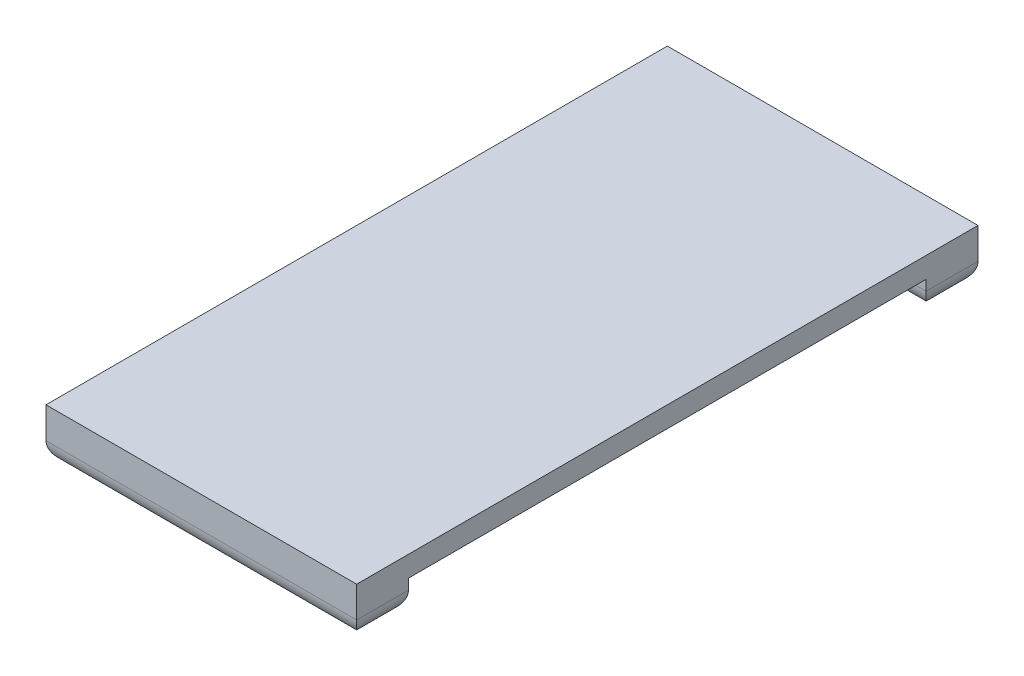
ISO-10303-21;
HEADER;
FILE_DESCRIPTION(('STEP AP214'),'2;1');
FILE_NAME('part.step','',(''),(''),'','','');
FILE_SCHEMA(('AUTOMOTIVE_DESIGN { 1 0 10303 214 1 1 1 1 }'));
ENDSEC;
DATA;
#1=APPLICATION_CONTEXT('core data for automotive mechanical design processes');
#2=APPLICATION_PROTOCOL_DEFINITION('international standard','automotive_design',2000,#1);
#3=PRODUCT_CONTEXT('',#1,'mechanical');
#4=PRODUCT('Part','Part','',(#3));
#5=PRODUCT_RELATED_PRODUCT_CATEGORY('part','',(#4));
#6=PRODUCT_DEFINITION_FORMATION('','',#4);
#7=PRODUCT_DEFINITION_CONTEXT('part definition',#1,'design');
#8=PRODUCT_DEFINITION('design','',#6,#7);
#9=PRODUCT_DEFINITION_SHAPE('','',#8);
#10=(LENGTH_UNIT() NAMED_UNIT(*) SI_UNIT(.MILLI.,.METRE.));
#11=(NAMED_UNIT(*) PLANE_ANGLE_UNIT() SI_UNIT($,.RADIAN.));
#12=(NAMED_UNIT(*) SI_UNIT($,.STERADIAN.) SOLID_ANGLE_UNIT());
#13=UNCERTAINTY_MEASURE_WITH_UNIT(LENGTH_MEASURE(1.E-05),#10,'distance_accuracy_value','');
#14=(GEOMETRIC_REPRESENTATION_CONTEXT(3) GLOBAL_UNCERTAINTY_ASSIGNED_CONTEXT((#13)) GLOBAL_UNIT_ASSIGNED_CONTEXT((#10,
#11,#12)) REPRESENTATION_CONTEXT('',''));
#15=CARTESIAN_POINT('',(0.,0.,0.));
#16=DIRECTION('',(0.,0.,1.));
#17=DIRECTION('',(1.,0.,0.));
#18=AXIS2_PLACEMENT_3D('',#15,#16,#17);
#19=CARTESIAN_POINT('',(-120.323741007194,30.,-16.8165467625899));
#20=DIRECTION('',(0.,0.,1.));
#21=DIRECTION('',(1.,0.,0.));
#22=AXIS2_PLACEMENT_3D('',#19,#20,#21);
#23=PLANE('',#22);
#24=DIRECTION('',(0.,-1.,0.));
#25=VECTOR('',#24,1.);
#26=CARTESIAN_POINT('',(4.67625899280566,36.,-16.8165467625899));
#27=LINE('',#26,#25);
#28=CARTESIAN_POINT('',(4.67625899280566,30.,-16.8165467625899));
#29=VERTEX_POINT('',#28);
#30=CARTESIAN_POINT('',(4.67625899280566,20.,-16.8165467625899));
#31=VERTEX_POINT('',#30);
#32=EDGE_CURVE('E180',#29,#31,#27,.T.);
#33=ORIENTED_EDGE('',*,*,#32,.T.);
#34=DIRECTION('',(-1.,0.,0.));
#35=VECTOR('',#34,1.);
#36=CARTESIAN_POINT('',(-120.323741007194,20.,-16.8165467625899));
#37=LINE('',#36,#35);
#38=CARTESIAN_POINT('',(-120.323741007194,20.,-16.8165467625899));
#39=VERTEX_POINT('',#38);
#40=EDGE_CURVE('E230',#31,#39,#37,.T.);
#41=ORIENTED_EDGE('',*,*,#40,.T.);
#42=DIRECTION('',(0.,-1.,0.));
#43=VECTOR('',#42,1.);
#44=CARTESIAN_POINT('',(-120.323741007194,30.,-16.8165467625899));
#45=LINE('',#44,#43);
#46=CARTESIAN_POINT('',(-120.323741007194,30.,-16.8165467625899));
#47=VERTEX_POINT('',#46);
#48=EDGE_CURVE('E293',#47,#39,#45,.T.);
#49=ORIENTED_EDGE('',*,*,#48,.F.);
#50=DIRECTION('',(-1.,0.,0.));
#51=VECTOR('',#50,1.);
#52=CARTESIAN_POINT('',(-120.323741007194,30.,-16.8165467625899));
#53=LINE('',#52,#51);
#54=EDGE_CURVE('E175',#29,#47,#53,.T.);
#55=ORIENTED_EDGE('',*,*,#54,.F.);
#56=EDGE_LOOP('',(#33,#41,#49,#55));
#57=FACE_BOUND('',#56,.T.);
#58=ADVANCED_FACE('F39',(#57),#23,.F.);
#59=CARTESIAN_POINT('',(-120.323741007194,30.,-516.81654676259));
#60=DIRECTION('',(0.,0.,-1.));
#61=DIRECTION('',(-1.,0.,0.));
#62=AXIS2_PLACEMENT_3D('',#59,#60,#61);
#63=PLANE('',#62);
#64=DIRECTION('',(0.,-1.,0.));
#65=VECTOR('',#64,1.);
#66=CARTESIAN_POINT('',(-120.323741007194,30.,-516.81654676259));
#67=LINE('',#66,#65);
#68=CARTESIAN_POINT('',(-120.323741007194,30.,-516.81654676259));
#69=VERTEX_POINT('',#68);
#70=CARTESIAN_POINT('',(-120.323741007194,20.,-516.81654676259));
#71=VERTEX_POINT('',#70);
#72=EDGE_CURVE('E174',#69,#71,#67,.T.);
#73=ORIENTED_EDGE('',*,*,#72,.T.);
#74=DIRECTION('',(1.,0.,0.));
#75=VECTOR('',#74,1.);
#76=CARTESIAN_POINT('',(-120.323741007194,20.,-516.81654676259));
#77=LINE('',#76,#75);
#78=CARTESIAN_POINT('',(4.67625899280566,20.,-516.81654676259));
#79=VERTEX_POINT('',#78);
#80=EDGE_CURVE('E226',#71,#79,#77,.T.);
#81=ORIENTED_EDGE('',*,*,#80,.T.);
#82=DIRECTION('',(0.,-1.,0.));
#83=VECTOR('',#82,1.);
#84=CARTESIAN_POINT('',(4.67625899280566,36.,-516.81654676259));
#85=LINE('',#84,#83);
#86=CARTESIAN_POINT('',(4.67625899280565,30.,-516.81654676259));
#87=VERTEX_POINT('',#86);
#88=EDGE_CURVE('E274',#87,#79,#85,.T.);
#89=ORIENTED_EDGE('',*,*,#88,.F.);
#90=DIRECTION('',(1.,0.,0.));
#91=VECTOR('',#90,1.);
#92=CARTESIAN_POINT('',(-120.323741007194,30.,-516.81654676259));
#93=LINE('',#92,#91);
#94=EDGE_CURVE('E289',#69,#87,#93,.T.);
#95=ORIENTED_EDGE('',*,*,#94,.F.);
#96=EDGE_LOOP('',(#73,#81,#89,#95));
#97=FACE_BOUND('',#96,.T.);
#98=ADVANCED_FACE('F370',(#97),#63,.F.);
#99=CARTESIAN_POINT('',(0.,30.,0.));
#100=DIRECTION('',(0.,-1.,0.));
#101=DIRECTION('',(0.,0.,-1.));
#102=AXIS2_PLACEMENT_3D('',#99,#100,#101);
#103=PLANE('',#102);
#104=DIRECTION('',(0.,0.,-1.));
#105=VECTOR('',#104,1.);
#106=CARTESIAN_POINT('',(4.67625899280566,30.,0.));
#107=LINE('',#106,#105);
#108=EDGE_CURVE('E184',#29,#87,#107,.T.);
#109=ORIENTED_EDGE('',*,*,#108,.F.);
#110=ORIENTED_EDGE('',*,*,#54,.T.);
#111=DIRECTION('',(0.,0.,-1.));
#112=VECTOR('',#111,1.);
#113=CARTESIAN_POINT('',(-120.323741007194,30.,-16.8165467625899));
#114=LINE('',#113,#112);
#115=EDGE_CURVE('E285',#47,#69,#114,.T.);
#116=ORIENTED_EDGE('',*,*,#115,.T.);
#117=ORIENTED_EDGE('',*,*,#94,.T.);
#118=EDGE_LOOP('',(#109,#110,#116,#117));
#119=FACE_BOUND('',#118,.T.);
#120=ADVANCED_FACE('F414',(#119),#103,.T.);
#121=CARTESIAN_POINT('',(-120.323741007194,50.,-566.81654676259));
#122=DIRECTION('',(1.,0.,0.));
#123=DIRECTION('',(0.,0.,-1.));
#124=AXIS2_PLACEMENT_3D('',#121,#122,#123);
#125=PLANE('',#124);
#126=DIRECTION('',(0.,-1.,0.));
#127=VECTOR('',#126,1.);
#128=CARTESIAN_POINT('',(-120.323741007194,50.,-566.81654676259));
#129=LINE('',#128,#127);
#130=CARTESIAN_POINT('',(-120.323741007194,50.,-566.81654676259));
#131=VERTEX_POINT('',#130);
#132=CARTESIAN_POINT('',(-120.323741007194,20.,-566.81654676259));
#133=VERTEX_POINT('',#132);
#134=EDGE_CURVE('E312',#131,#133,#129,.T.);
#135=ORIENTED_EDGE('',*,*,#134,.T.);
#136=DIRECTION('',(0.,0.,1.));
#137=VECTOR('',#136,1.);
#138=CARTESIAN_POINT('',(-120.323741007194,20.,-566.81654676259));
#139=LINE('',#138,#137);
#140=EDGE_CURVE('E224',#133,#71,#139,.T.);
#141=ORIENTED_EDGE('',*,*,#140,.T.);
#142=ORIENTED_EDGE('',*,*,#72,.F.);
#143=ORIENTED_EDGE('',*,*,#115,.F.);
#144=ORIENTED_EDGE('',*,*,#48,.T.);
#145=DIRECTION('',(0.,0.,1.));
#146=VECTOR('',#145,1.);
#147=CARTESIAN_POINT('',(-120.323741007194,20.,-566.81654676259));
#148=LINE('',#147,#146);
#149=CARTESIAN_POINT('',(-120.323741007194,20.,33.1834532374101));
#150=VERTEX_POINT('',#149);
#151=EDGE_CURVE('E222',#39,#150,#148,.T.);
#152=ORIENTED_EDGE('',*,*,#151,.T.);
#153=DIRECTION('',(0.,-1.,0.));
#154=VECTOR('',#153,1.);
#155=CARTESIAN_POINT('',(-120.323741007194,50.,33.1834532374101));
#156=LINE('',#155,#154);
#157=CARTESIAN_POINT('',(-120.323741007194,50.,33.1834532374101));
#158=VERTEX_POINT('',#157);
#159=EDGE_CURVE('E185',#158,#150,#156,.T.);
#160=ORIENTED_EDGE('',*,*,#159,.F.);
#161=DIRECTION('',(0.,0.,1.));
#162=VECTOR('',#161,1.);
#163=CARTESIAN_POINT('',(-120.323741007194,50.,-566.81654676259));
#164=LINE('',#163,#162);
#165=EDGE_CURVE('E296',#131,#158,#164,.T.);
#166=ORIENTED_EDGE('',*,*,#165,.F.);
#167=EDGE_LOOP('',(#135,#141,#142,#143,#144,#152,#160,#166));
#168=FACE_BOUND('',#167,.T.);
#169=ADVANCED_FACE('F365',(#168),#125,.F.);
#170=CARTESIAN_POINT('',(-120.323741007194,50.,33.1834532374101));
#171=DIRECTION('',(0.,0.,-1.));
#172=DIRECTION('',(-1.,0.,0.));
#173=AXIS2_PLACEMENT_3D('',#170,#171,#172);
#174=PLANE('',#173);
#175=ORIENTED_EDGE('',*,*,#159,.T.);
#176=DIRECTION('',(1.,0.,0.));
#177=VECTOR('',#176,1.);
#178=CARTESIAN_POINT('',(-120.323741007194,20.,33.1834532374101));
#179=LINE('',#178,#177);
#180=CARTESIAN_POINT('',(179.676258992806,20.,33.1834532374101));
#181=VERTEX_POINT('',#180);
#182=EDGE_CURVE('E232',#150,#181,#179,.T.);
#183=ORIENTED_EDGE('',*,*,#182,.T.);
#184=DIRECTION('',(0.,-1.,0.));
#185=VECTOR('',#184,1.);
#186=CARTESIAN_POINT('',(179.676258992806,50.,33.1834532374101));
#187=LINE('',#186,#185);
#188=CARTESIAN_POINT('',(179.676258992806,50.,33.1834532374101));
#189=VERTEX_POINT('',#188);
#190=EDGE_CURVE('E191',#189,#181,#187,.T.);
#191=ORIENTED_EDGE('',*,*,#190,.F.);
#192=DIRECTION('',(1.,0.,0.));
#193=VECTOR('',#192,1.);
#194=CARTESIAN_POINT('',(-120.323741007194,50.,33.1834532374101));
#195=LINE('',#194,#193);
#196=EDGE_CURVE('E306',#158,#189,#195,.T.);
#197=ORIENTED_EDGE('',*,*,#196,.F.);
#198=EDGE_LOOP('',(#175,#183,#191,#197));
#199=FACE_BOUND('',#198,.T.);
#200=ADVANCED_FACE('F393',(#199),#174,.F.);
#201=CARTESIAN_POINT('',(179.676258992806,50.,-566.81654676259));
#202=DIRECTION('',(-1.,0.,0.));
#203=DIRECTION('',(0.,0.,1.));
#204=AXIS2_PLACEMENT_3D('',#201,#202,#203);
#205=PLANE('',#204);
#206=ORIENTED_EDGE('',*,*,#190,.T.);
#207=DIRECTION('',(0.,0.,-1.));
#208=VECTOR('',#207,1.);
#209=CARTESIAN_POINT('',(179.676258992806,20.,-566.81654676259));
#210=LINE('',#209,#208);
#211=CARTESIAN_POINT('',(179.676258992806,20.,-16.8165467625899));
#212=VERTEX_POINT('',#211);
#213=EDGE_CURVE('E236',#181,#212,#210,.T.);
#214=ORIENTED_EDGE('',*,*,#213,.T.);
#215=DIRECTION('',(0.,-1.,0.));
#216=VECTOR('',#215,1.);
#217=CARTESIAN_POINT('',(179.676258992806,30.,-16.8165467625899));
#218=LINE('',#217,#216);
#219=CARTESIAN_POINT('',(179.676258992806,30.,-16.8165467625899));
#220=VERTEX_POINT('',#219);
#221=EDGE_CURVE('E297',#220,#212,#218,.T.);
#222=ORIENTED_EDGE('',*,*,#221,.F.);
#223=DIRECTION('',(0.,0.,1.));
#224=VECTOR('',#223,1.);
#225=CARTESIAN_POINT('',(179.676258992806,30.,-16.8165467625899));
#226=LINE('',#225,#224);
#227=CARTESIAN_POINT('',(179.676258992806,30.,-516.81654676259));
#228=VERTEX_POINT('',#227);
#229=EDGE_CURVE('E172',#228,#220,#226,.T.);
#230=ORIENTED_EDGE('',*,*,#229,.F.);
#231=DIRECTION('',(0.,-1.,0.));
#232=VECTOR('',#231,1.);
#233=CARTESIAN_POINT('',(179.676258992806,30.,-516.81654676259));
#234=LINE('',#233,#232);
#235=CARTESIAN_POINT('',(179.676258992806,20.,-516.81654676259));
#236=VERTEX_POINT('',#235);
#237=EDGE_CURVE('E299',#228,#236,#234,.T.);
#238=ORIENTED_EDGE('',*,*,#237,.T.);
#239=DIRECTION('',(0.,0.,-1.));
#240=VECTOR('',#239,1.);
#241=CARTESIAN_POINT('',(179.676258992806,20.,-566.81654676259));
#242=LINE('',#241,#240);
#243=CARTESIAN_POINT('',(179.676258992806,20.,-566.81654676259));
#244=VERTEX_POINT('',#243);
#245=EDGE_CURVE('E234',#236,#244,#242,.T.);
#246=ORIENTED_EDGE('',*,*,#245,.T.);
#247=DIRECTION('',(0.,-1.,0.));
#248=VECTOR('',#247,1.);
#249=CARTESIAN_POINT('',(179.676258992806,50.,-566.81654676259));
#250=LINE('',#249,#248);
#251=CARTESIAN_POINT('',(179.676258992806,50.,-566.81654676259));
#252=VERTEX_POINT('',#251);
#253=EDGE_CURVE('E315',#252,#244,#250,.T.);
#254=ORIENTED_EDGE('',*,*,#253,.F.);
#255=DIRECTION('',(0.,0.,-1.));
#256=VECTOR('',#255,1.);
#257=CARTESIAN_POINT('',(179.676258992806,50.,-566.81654676259));
#258=LINE('',#257,#256);
#259=EDGE_CURVE('E308',#189,#252,#258,.T.);
#260=ORIENTED_EDGE('',*,*,#259,.F.);
#261=EDGE_LOOP('',(#206,#214,#222,#230,#238,#246,#254,#260));
#262=FACE_BOUND('',#261,.T.);
#263=ADVANCED_FACE('F321',(#262),#205,.F.);
#264=CARTESIAN_POINT('',(-120.323741007194,50.,-566.81654676259));
#265=DIRECTION('',(0.,0.,1.));
#266=DIRECTION('',(1.,0.,0.));
#267=AXIS2_PLACEMENT_3D('',#264,#265,#266);
#268=PLANE('',#267);
#269=ORIENTED_EDGE('',*,*,#253,.T.);
#270=DIRECTION('',(-1.,0.,0.));
#271=VECTOR('',#270,1.);
#272=CARTESIAN_POINT('',(-120.323741007194,20.,-566.81654676259));
#273=LINE('',#272,#271);
#274=EDGE_CURVE('E188',#244,#133,#273,.T.);
#275=ORIENTED_EDGE('',*,*,#274,.T.);
#276=ORIENTED_EDGE('',*,*,#134,.F.);
#277=DIRECTION('',(-1.,0.,0.));
#278=VECTOR('',#277,1.);
#279=CARTESIAN_POINT('',(-120.323741007194,50.,-566.81654676259));
#280=LINE('',#279,#278);
#281=EDGE_CURVE('E310',#252,#131,#280,.T.);
#282=ORIENTED_EDGE('',*,*,#281,.F.);
#283=EDGE_LOOP('',(#269,#275,#276,#282));
#284=FACE_BOUND('',#283,.T.);
#285=ADVANCED_FACE('F349',(#284),#268,.F.);
#286=CARTESIAN_POINT('',(0.,50.,0.));
#287=DIRECTION('',(0.,1.,0.));
#288=DIRECTION('',(0.,0.,1.));
#289=AXIS2_PLACEMENT_3D('',#286,#287,#288);
#290=PLANE('',#289);
#291=ORIENTED_EDGE('',*,*,#165,.T.);
#292=ORIENTED_EDGE('',*,*,#196,.T.);
#293=ORIENTED_EDGE('',*,*,#259,.T.);
#294=ORIENTED_EDGE('',*,*,#281,.T.);
#295=EDGE_LOOP('',(#291,#292,#293,#294));
#296=FACE_BOUND('',#295,.T.);
#297=ADVANCED_FACE('F395',(#296),#290,.T.);
#298=CARTESIAN_POINT('',(0.,0.,0.));
#299=DIRECTION('',(0.,1.,0.));
#300=DIRECTION('',(0.,0.,1.));
#301=AXIS2_PLACEMENT_3D('',#298,#299,#300);
#302=PLANE('',#301);
#303=DIRECTION('',(0.,0.,1.));
#304=VECTOR('',#303,1.);
#305=CARTESIAN_POINT('',(-100.323741007194,0.,0.));
#306=LINE('',#305,#304);
#307=CARTESIAN_POINT('',(-100.323741007194,0.,-536.81654676259));
#308=VERTEX_POINT('',#307);
#309=CARTESIAN_POINT('',(-100.323741007194,0.,-546.81654676259));
#310=VERTEX_POINT('',#309);
#311=EDGE_CURVE('E217',#308,#310,#306,.F.);
#312=ORIENTED_EDGE('',*,*,#311,.T.);
#313=DIRECTION('',(-1.,0.,0.));
#314=VECTOR('',#313,1.);
#315=CARTESIAN_POINT('',(0.,0.,-546.81654676259));
#316=LINE('',#315,#314);
#317=CARTESIAN_POINT('',(159.676258992806,0.,-546.81654676259));
#318=VERTEX_POINT('',#317);
#319=EDGE_CURVE('E219',#310,#318,#316,.F.);
#320=ORIENTED_EDGE('',*,*,#319,.T.);
#321=DIRECTION('',(0.,0.,-1.));
#322=VECTOR('',#321,1.);
#323=CARTESIAN_POINT('',(159.676258992806,0.,0.));
#324=LINE('',#323,#322);
#325=CARTESIAN_POINT('',(159.676258992806,0.,-536.81654676259));
#326=VERTEX_POINT('',#325);
#327=EDGE_CURVE('E197',#318,#326,#324,.F.);
#328=ORIENTED_EDGE('',*,*,#327,.T.);
#329=DIRECTION('',(1.,0.,0.));
#330=VECTOR('',#329,1.);
#331=CARTESIAN_POINT('',(-1.98662030071865E-13,0.,-536.81654676259));
#332=LINE('',#331,#330);
#333=CARTESIAN_POINT('',(34.6762589928057,0.,-536.81654676259));
#334=VERTEX_POINT('',#333);
#335=EDGE_CURVE('E199',#326,#334,#332,.F.);
#336=ORIENTED_EDGE('',*,*,#335,.T.);
#337=DIRECTION('',(0.,0.,1.));
#338=VECTOR('',#337,1.);
#339=CARTESIAN_POINT('',(34.6762589928057,0.,-16.8165467625899));
#340=LINE('',#339,#338);
#341=CARTESIAN_POINT('',(34.6762589928057,0.,3.1834532374101));
#342=VERTEX_POINT('',#341);
#343=EDGE_CURVE('E201',#334,#342,#340,.T.);
#344=ORIENTED_EDGE('',*,*,#343,.T.);
#345=DIRECTION('',(-1.,0.,0.));
#346=VECTOR('',#345,1.);
#347=CARTESIAN_POINT('',(0.,0.,3.1834532374101));
#348=LINE('',#347,#346);
#349=CARTESIAN_POINT('',(159.676258992806,0.,3.18345323741012));
#350=VERTEX_POINT('',#349);
#351=EDGE_CURVE('E203',#342,#350,#348,.F.);
#352=ORIENTED_EDGE('',*,*,#351,.T.);
#353=DIRECTION('',(0.,0.,-1.));
#354=VECTOR('',#353,1.);
#355=CARTESIAN_POINT('',(159.676258992806,0.,0.));
#356=LINE('',#355,#354);
#357=CARTESIAN_POINT('',(159.676258992806,0.,13.1834532374101));
#358=VERTEX_POINT('',#357);
#359=EDGE_CURVE('E205',#350,#358,#356,.F.);
#360=ORIENTED_EDGE('',*,*,#359,.T.);
#361=DIRECTION('',(1.,0.,0.));
#362=VECTOR('',#361,1.);
#363=CARTESIAN_POINT('',(0.,0.,13.1834532374101));
#364=LINE('',#363,#362);
#365=CARTESIAN_POINT('',(-100.323741007194,0.,13.1834532374101));
#366=VERTEX_POINT('',#365);
#367=EDGE_CURVE('E207',#358,#366,#364,.F.);
#368=ORIENTED_EDGE('',*,*,#367,.T.);
#369=DIRECTION('',(0.,0.,1.));
#370=VECTOR('',#369,1.);
#371=CARTESIAN_POINT('',(-100.323741007194,0.,0.));
#372=LINE('',#371,#370);
#373=CARTESIAN_POINT('',(-100.323741007194,0.,3.18345323741008));
#374=VERTEX_POINT('',#373);
#375=EDGE_CURVE('E209',#366,#374,#372,.F.);
#376=ORIENTED_EDGE('',*,*,#375,.T.);
#377=DIRECTION('',(-1.,0.,0.));
#378=VECTOR('',#377,1.);
#379=CARTESIAN_POINT('',(0.,0.,3.1834532374101));
#380=LINE('',#379,#378);
#381=CARTESIAN_POINT('',(24.6762589928057,0.,3.1834532374101));
#382=VERTEX_POINT('',#381);
#383=EDGE_CURVE('E211',#374,#382,#380,.F.);
#384=ORIENTED_EDGE('',*,*,#383,.T.);
#385=DIRECTION('',(0.,0.,-1.));
#386=VECTOR('',#385,1.);
#387=CARTESIAN_POINT('',(24.6762589928057,0.,-516.81654676259));
#388=LINE('',#387,#386);
#389=CARTESIAN_POINT('',(24.6762589928057,0.,-536.81654676259));
#390=VERTEX_POINT('',#389);
#391=EDGE_CURVE('E213',#382,#390,#388,.T.);
#392=ORIENTED_EDGE('',*,*,#391,.T.);
#393=DIRECTION('',(1.,0.,0.));
#394=VECTOR('',#393,1.);
#395=CARTESIAN_POINT('',(-1.98662030071865E-13,0.,-536.81654676259));
#396=LINE('',#395,#394);
#397=EDGE_CURVE('E215',#390,#308,#396,.F.);
#398=ORIENTED_EDGE('',*,*,#397,.T.);
#399=EDGE_LOOP('',(#312,#320,#328,#336,#344,#352,#360,#368,#376,#384,#392,#398));
#400=FACE_BOUND('',#399,.T.);
#401=ADVANCED_FACE('F397',(#400),#302,.F.);
#402=ORIENTED_EDGE('',*,*,#221,.T.);
#403=DIRECTION('',(-1.,0.,0.));
#404=VECTOR('',#403,1.);
#405=CARTESIAN_POINT('',(-120.323741007194,20.,-16.8165467625899));
#406=LINE('',#405,#404);
#407=CARTESIAN_POINT('',(54.6762589928057,20.,-16.8165467625899));
#408=VERTEX_POINT('',#407);
#409=EDGE_CURVE('E63',#212,#408,#406,.T.);
#410=ORIENTED_EDGE('',*,*,#409,.T.);
#411=DIRECTION('',(0.,-1.,0.));
#412=VECTOR('',#411,1.);
#413=CARTESIAN_POINT('',(54.6762589928057,36.,-16.8165467625899));
#414=LINE('',#413,#412);
#415=CARTESIAN_POINT('',(54.6762589928057,30.,-16.8165467625899));
#416=VERTEX_POINT('',#415);
#417=EDGE_CURVE('E177',#416,#408,#414,.T.);
#418=ORIENTED_EDGE('',*,*,#417,.F.);
#419=EDGE_CURVE('E166',#220,#416,#53,.T.);
#420=ORIENTED_EDGE('',*,*,#419,.F.);
#421=EDGE_LOOP('',(#402,#410,#418,#420));
#422=FACE_BOUND('',#421,.T.);
#423=ADVANCED_FACE('F178',(#422),#23,.F.);
#424=DIRECTION('',(0.,-1.,0.));
#425=VECTOR('',#424,1.);
#426=CARTESIAN_POINT('',(54.6762589928057,36.,-516.81654676259));
#427=LINE('',#426,#425);
#428=CARTESIAN_POINT('',(54.6762589928057,30.,-516.81654676259));
#429=VERTEX_POINT('',#428);
#430=CARTESIAN_POINT('',(54.6762589928057,20.,-516.81654676259));
#431=VERTEX_POINT('',#430);
#432=EDGE_CURVE('E181',#429,#431,#427,.T.);
#433=ORIENTED_EDGE('',*,*,#432,.T.);
#434=DIRECTION('',(1.,0.,0.));
#435=VECTOR('',#434,1.);
#436=CARTESIAN_POINT('',(-120.323741007194,20.,-516.81654676259));
#437=LINE('',#436,#435);
#438=EDGE_CURVE('E11',#431,#236,#437,.T.);
#439=ORIENTED_EDGE('',*,*,#438,.T.);
#440=ORIENTED_EDGE('',*,*,#237,.F.);
#441=EDGE_CURVE('E288',#429,#228,#93,.T.);
#442=ORIENTED_EDGE('',*,*,#441,.F.);
#443=EDGE_LOOP('',(#433,#439,#440,#442));
#444=FACE_BOUND('',#443,.T.);
#445=ADVANCED_FACE('F344',(#444),#63,.F.);
#446=DIRECTION('',(0.,0.,1.));
#447=VECTOR('',#446,1.);
#448=CARTESIAN_POINT('',(54.6762589928057,30.,0.));
#449=LINE('',#448,#447);
#450=EDGE_CURVE('E169',#429,#416,#449,.T.);
#451=ORIENTED_EDGE('',*,*,#450,.F.);
#452=ORIENTED_EDGE('',*,*,#441,.T.);
#453=ORIENTED_EDGE('',*,*,#229,.T.);
#454=ORIENTED_EDGE('',*,*,#419,.T.);
#455=EDGE_LOOP('',(#451,#452,#453,#454));
#456=FACE_BOUND('',#455,.T.);
#457=ADVANCED_FACE('F167',(#456),#103,.T.);
#458=CARTESIAN_POINT('',(4.67625899280566,36.,-16.8165467625899));
#459=DIRECTION('',(-1.,0.,0.));
#460=DIRECTION('',(0.,0.,1.));
#461=AXIS2_PLACEMENT_3D('',#458,#459,#460);
#462=PLANE('',#461);
#463=ORIENTED_EDGE('',*,*,#88,.T.);
#464=DIRECTION('',(0.,0.,-1.));
#465=VECTOR('',#464,1.);
#466=CARTESIAN_POINT('',(4.67625899280566,20.,-16.8165467625899));
#467=LINE('',#466,#465);
#468=EDGE_CURVE('E228',#79,#31,#467,.F.);
#469=ORIENTED_EDGE('',*,*,#468,.T.);
#470=ORIENTED_EDGE('',*,*,#32,.F.);
#471=ORIENTED_EDGE('',*,*,#108,.T.);
#472=EDGE_LOOP('',(#463,#469,#470,#471));
#473=FACE_BOUND('',#472,.T.);
#474=ADVANCED_FACE('F381',(#473),#462,.T.);
#475=CARTESIAN_POINT('',(54.6762589928057,36.,-16.8165467625899));
#476=DIRECTION('',(1.,0.,0.));
#477=DIRECTION('',(0.,0.,-1.));
#478=AXIS2_PLACEMENT_3D('',#475,#476,#477);
#479=PLANE('',#478);
#480=ORIENTED_EDGE('',*,*,#417,.T.);
#481=DIRECTION('',(0.,0.,1.));
#482=VECTOR('',#481,1.);
#483=CARTESIAN_POINT('',(54.6762589928057,20.,-516.81654676259));
#484=LINE('',#483,#482);
#485=EDGE_CURVE('E48',#408,#431,#484,.F.);
#486=ORIENTED_EDGE('',*,*,#485,.T.);
#487=ORIENTED_EDGE('',*,*,#432,.F.);
#488=ORIENTED_EDGE('',*,*,#450,.T.);
#489=EDGE_LOOP('',(#480,#486,#487,#488));
#490=FACE_BOUND('',#489,.T.);
#491=ADVANCED_FACE('F183',(#490),#479,.T.);
#492=CARTESIAN_POINT('',(-120.323741007194,20.,13.1834532374101));
#493=DIRECTION('',(1.,0.,0.));
#494=DIRECTION('',(0.,0.,-1.));
#495=AXIS2_PLACEMENT_3D('',#492,#493,#494);
#496=CYLINDRICAL_SURFACE('',#495,20.);
#497=CARTESIAN_POINT('',(-100.323741007194,20.,13.1834532374101));
#498=DIRECTION('',(0.707106781186548,0.,0.707106781186547));
#499=DIRECTION('',(0.707106781186547,0.,-0.707106781186548));
#500=AXIS2_PLACEMENT_3D('',#497,#498,#499);
#501=ELLIPSE('',#500,28.2842712474619,20.);
#502=EDGE_CURVE('E267',#366,#150,#501,.F.);
#503=ORIENTED_EDGE('',*,*,#502,.F.);
#504=ORIENTED_EDGE('',*,*,#367,.F.);
#505=CARTESIAN_POINT('',(159.676258992806,20.,13.1834532374101));
#506=DIRECTION('',(0.707106781186547,0.,-0.707106781186548));
#507=DIRECTION('',(-0.707106781186547,0.,-0.707106781186547));
#508=AXIS2_PLACEMENT_3D('',#505,#506,#507);
#509=ELLIPSE('',#508,28.2842712474619,20.);
#510=EDGE_CURVE('E43',#181,#358,#509,.T.);
#511=ORIENTED_EDGE('',*,*,#510,.F.);
#512=ORIENTED_EDGE('',*,*,#182,.F.);
#513=EDGE_LOOP('',(#503,#504,#511,#512));
#514=FACE_BOUND('',#513,.T.);
#515=ADVANCED_FACE('F41',(#514),#496,.T.);
#516=CARTESIAN_POINT('',(159.676258992806,20.,-566.81654676259));
#517=DIRECTION('',(0.,0.,-1.));
#518=DIRECTION('',(-1.,0.,0.));
#519=AXIS2_PLACEMENT_3D('',#516,#517,#518);
#520=CYLINDRICAL_SURFACE('',#519,20.);
#521=ORIENTED_EDGE('',*,*,#510,.T.);
#522=ORIENTED_EDGE('',*,*,#359,.F.);
#523=CARTESIAN_POINT('',(159.676258992806,20.,3.18345323741011));
#524=DIRECTION('',(-0.707106781186547,0.,-0.707106781186548));
#525=DIRECTION('',(-0.707106781186547,0.,0.707106781186547));
#526=AXIS2_PLACEMENT_3D('',#523,#524,#525);
#527=ELLIPSE('',#526,28.2842712474619,20.);
#528=EDGE_CURVE('E265',#212,#350,#527,.T.);
#529=ORIENTED_EDGE('',*,*,#528,.F.);
#530=ORIENTED_EDGE('',*,*,#213,.F.);
#531=EDGE_LOOP('',(#521,#522,#529,#530));
#532=FACE_BOUND('',#531,.T.);
#533=ADVANCED_FACE('F328',(#532),#520,.T.);
#534=CARTESIAN_POINT('',(-100.323741007194,20.,-566.81654676259));
#535=DIRECTION('',(0.,0.,1.));
#536=DIRECTION('',(1.,0.,0.));
#537=AXIS2_PLACEMENT_3D('',#534,#535,#536);
#538=CYLINDRICAL_SURFACE('',#537,20.);
#539=ORIENTED_EDGE('',*,*,#502,.T.);
#540=ORIENTED_EDGE('',*,*,#151,.F.);
#541=CARTESIAN_POINT('',(-100.323741007194,20.,3.18345323741009));
#542=DIRECTION('',(-0.707106781186547,0.,0.707106781186547));
#543=DIRECTION('',(0.707106781186547,0.,0.707106781186547));
#544=AXIS2_PLACEMENT_3D('',#541,#542,#543);
#545=ELLIPSE('',#544,28.2842712474619,20.);
#546=EDGE_CURVE('E262',#374,#39,#545,.F.);
#547=ORIENTED_EDGE('',*,*,#546,.F.);
#548=ORIENTED_EDGE('',*,*,#375,.F.);
#549=EDGE_LOOP('',(#539,#540,#547,#548));
#550=FACE_BOUND('',#549,.T.);
#551=ADVANCED_FACE('F391',(#550),#538,.T.);
#552=CARTESIAN_POINT('',(-120.323741007194,20.,3.18345323741008));
#553=DIRECTION('',(-1.,0.,0.));
#554=DIRECTION('',(0.,0.,1.));
#555=AXIS2_PLACEMENT_3D('',#552,#553,#554);
#556=CYLINDRICAL_SURFACE('',#555,20.);
#557=ORIENTED_EDGE('',*,*,#528,.T.);
#558=ORIENTED_EDGE('',*,*,#351,.F.);
#559=CARTESIAN_POINT('',(34.6762589928057,20.,3.1834532374101));
#560=DIRECTION('',(-0.707106781186547,0.,-0.707106781186548));
#561=DIRECTION('',(-0.707106781186548,0.,0.707106781186547));
#562=AXIS2_PLACEMENT_3D('',#559,#560,#561);
#563=ELLIPSE('',#562,28.2842712474619,20.);
#564=EDGE_CURVE('E259',#408,#342,#563,.T.);
#565=ORIENTED_EDGE('',*,*,#564,.F.);
#566=ORIENTED_EDGE('',*,*,#409,.F.);
#567=EDGE_LOOP('',(#557,#558,#565,#566));
#568=FACE_BOUND('',#567,.T.);
#569=ADVANCED_FACE('F331',(#568),#556,.T.);
#570=CARTESIAN_POINT('',(-120.323741007194,20.,3.18345323741008));
#571=DIRECTION('',(-1.,0.,0.));
#572=DIRECTION('',(0.,0.,1.));
#573=AXIS2_PLACEMENT_3D('',#570,#571,#572);
#574=CYLINDRICAL_SURFACE('',#573,20.);
#575=ORIENTED_EDGE('',*,*,#546,.T.);
#576=ORIENTED_EDGE('',*,*,#40,.F.);
#577=CARTESIAN_POINT('',(24.6762589928057,20.,3.1834532374101));
#578=DIRECTION('',(-0.707106781186548,0.,0.707106781186547));
#579=DIRECTION('',(0.707106781186547,0.,0.707106781186548));
#580=AXIS2_PLACEMENT_3D('',#577,#578,#579);
#581=ELLIPSE('',#580,28.2842712474619,20.);
#582=EDGE_CURVE('E256',#382,#31,#581,.F.);
#583=ORIENTED_EDGE('',*,*,#582,.F.);
#584=ORIENTED_EDGE('',*,*,#383,.F.);
#585=EDGE_LOOP('',(#575,#576,#583,#584));
#586=FACE_BOUND('',#585,.T.);
#587=ADVANCED_FACE('F388',(#586),#574,.T.);
#588=CARTESIAN_POINT('',(34.6762589928057,20.,0.));
#589=DIRECTION('',(0.,0.,-1.));
#590=DIRECTION('',(-1.,0.,0.));
#591=AXIS2_PLACEMENT_3D('',#588,#589,#590);
#592=CYLINDRICAL_SURFACE('',#591,20.);
#593=ORIENTED_EDGE('',*,*,#564,.T.);
#594=ORIENTED_EDGE('',*,*,#343,.F.);
#595=CARTESIAN_POINT('',(34.6762589928057,20.,-536.81654676259));
#596=DIRECTION('',(0.707106781186547,0.,-0.707106781186548));
#597=DIRECTION('',(-0.707106781186548,0.,-0.707106781186547));
#598=AXIS2_PLACEMENT_3D('',#595,#596,#597);
#599=ELLIPSE('',#598,28.2842712474619,20.);
#600=EDGE_CURVE('E253',#431,#334,#599,.T.);
#601=ORIENTED_EDGE('',*,*,#600,.F.);
#602=ORIENTED_EDGE('',*,*,#485,.F.);
#603=EDGE_LOOP('',(#593,#594,#601,#602));
#604=FACE_BOUND('',#603,.T.);
#605=ADVANCED_FACE('F335',(#604),#592,.T.);
#606=CARTESIAN_POINT('',(24.6762589928057,20.,0.));
#607=DIRECTION('',(0.,0.,1.));
#608=DIRECTION('',(1.,0.,0.));
#609=AXIS2_PLACEMENT_3D('',#606,#607,#608);
#610=CYLINDRICAL_SURFACE('',#609,20.);
#611=ORIENTED_EDGE('',*,*,#582,.T.);
#612=ORIENTED_EDGE('',*,*,#468,.F.);
#613=CARTESIAN_POINT('',(24.6762589928057,20.,-536.81654676259));
#614=DIRECTION('',(0.707106781186548,0.,0.707106781186547));
#615=DIRECTION('',(0.707106781186547,0.,-0.707106781186548));
#616=AXIS2_PLACEMENT_3D('',#613,#614,#615);
#617=ELLIPSE('',#616,28.2842712474619,20.);
#618=EDGE_CURVE('E250',#390,#79,#617,.F.);
#619=ORIENTED_EDGE('',*,*,#618,.F.);
#620=ORIENTED_EDGE('',*,*,#391,.F.);
#621=EDGE_LOOP('',(#611,#612,#619,#620));
#622=FACE_BOUND('',#621,.T.);
#623=ADVANCED_FACE('F377',(#622),#610,.T.);
#624=CARTESIAN_POINT('',(-120.323741007194,20.,-536.81654676259));
#625=DIRECTION('',(1.,0.,0.));
#626=DIRECTION('',(0.,0.,-1.));
#627=AXIS2_PLACEMENT_3D('',#624,#625,#626);
#628=CYLINDRICAL_SURFACE('',#627,20.);
#629=ORIENTED_EDGE('',*,*,#600,.T.);
#630=ORIENTED_EDGE('',*,*,#335,.F.);
#631=CARTESIAN_POINT('',(159.676258992806,20.,-536.81654676259));
#632=DIRECTION('',(0.707106781186547,0.,-0.707106781186548));
#633=DIRECTION('',(-0.707106781186548,0.,-0.707106781186547));
#634=AXIS2_PLACEMENT_3D('',#631,#632,#633);
#635=ELLIPSE('',#634,28.2842712474619,20.);
#636=EDGE_CURVE('E247',#236,#326,#635,.T.);
#637=ORIENTED_EDGE('',*,*,#636,.F.);
#638=ORIENTED_EDGE('',*,*,#438,.F.);
#639=EDGE_LOOP('',(#629,#630,#637,#638));
#640=FACE_BOUND('',#639,.T.);
#641=ADVANCED_FACE('F340',(#640),#628,.T.);
#642=CARTESIAN_POINT('',(-120.323741007194,20.,-536.81654676259));
#643=DIRECTION('',(1.,0.,0.));
#644=DIRECTION('',(0.,0.,-1.));
#645=AXIS2_PLACEMENT_3D('',#642,#643,#644);
#646=CYLINDRICAL_SURFACE('',#645,20.);
#647=ORIENTED_EDGE('',*,*,#618,.T.);
#648=ORIENTED_EDGE('',*,*,#80,.F.);
#649=CARTESIAN_POINT('',(-100.323741007194,20.,-536.81654676259));
#650=DIRECTION('',(0.707106781186548,0.,0.707106781186547));
#651=DIRECTION('',(0.707106781186547,0.,-0.707106781186548));
#652=AXIS2_PLACEMENT_3D('',#649,#650,#651);
#653=ELLIPSE('',#652,28.2842712474619,20.);
#654=EDGE_CURVE('E244',#308,#71,#653,.F.);
#655=ORIENTED_EDGE('',*,*,#654,.F.);
#656=ORIENTED_EDGE('',*,*,#397,.F.);
#657=EDGE_LOOP('',(#647,#648,#655,#656));
#658=FACE_BOUND('',#657,.T.);
#659=ADVANCED_FACE('F372',(#658),#646,.T.);
#660=CARTESIAN_POINT('',(159.676258992806,20.,-566.81654676259));
#661=DIRECTION('',(0.,0.,-1.));
#662=DIRECTION('',(-1.,0.,0.));
#663=AXIS2_PLACEMENT_3D('',#660,#661,#662);
#664=CYLINDRICAL_SURFACE('',#663,20.);
#665=ORIENTED_EDGE('',*,*,#636,.T.);
#666=ORIENTED_EDGE('',*,*,#327,.F.);
#667=CARTESIAN_POINT('',(159.676258992806,20.,-546.81654676259));
#668=DIRECTION('',(-0.707106781186547,0.,-0.707106781186547));
#669=DIRECTION('',(0.707106781186547,0.,-0.707106781186548));
#670=AXIS2_PLACEMENT_3D('',#667,#668,#669);
#671=ELLIPSE('',#670,28.2842712474619,20.);
#672=EDGE_CURVE('E242',#244,#318,#671,.T.);
#673=ORIENTED_EDGE('',*,*,#672,.F.);
#674=ORIENTED_EDGE('',*,*,#245,.F.);
#675=EDGE_LOOP('',(#665,#666,#673,#674));
#676=FACE_BOUND('',#675,.T.);
#677=ADVANCED_FACE('F353',(#676),#664,.T.);
#678=CARTESIAN_POINT('',(-100.323741007194,20.,-566.81654676259));
#679=DIRECTION('',(0.,0.,1.));
#680=DIRECTION('',(1.,0.,0.));
#681=AXIS2_PLACEMENT_3D('',#678,#679,#680);
#682=CYLINDRICAL_SURFACE('',#681,20.);
#683=ORIENTED_EDGE('',*,*,#654,.T.);
#684=ORIENTED_EDGE('',*,*,#140,.F.);
#685=CARTESIAN_POINT('',(-100.323741007194,20.,-546.81654676259));
#686=DIRECTION('',(-0.707106781186547,0.,0.707106781186548));
#687=DIRECTION('',(0.707106781186548,0.,0.707106781186547));
#688=AXIS2_PLACEMENT_3D('',#685,#686,#687);
#689=ELLIPSE('',#688,28.2842712474619,20.);
#690=EDGE_CURVE('E240',#310,#133,#689,.F.);
#691=ORIENTED_EDGE('',*,*,#690,.F.);
#692=ORIENTED_EDGE('',*,*,#311,.F.);
#693=EDGE_LOOP('',(#683,#684,#691,#692));
#694=FACE_BOUND('',#693,.T.);
#695=ADVANCED_FACE('F361',(#694),#682,.T.);
#696=CARTESIAN_POINT('',(-120.323741007194,20.,-546.81654676259));
#697=DIRECTION('',(-1.,0.,0.));
#698=DIRECTION('',(0.,0.,1.));
#699=AXIS2_PLACEMENT_3D('',#696,#697,#698);
#700=CYLINDRICAL_SURFACE('',#699,20.);
#701=ORIENTED_EDGE('',*,*,#672,.T.);
#702=ORIENTED_EDGE('',*,*,#319,.F.);
#703=ORIENTED_EDGE('',*,*,#690,.T.);
#704=ORIENTED_EDGE('',*,*,#274,.F.);
#705=EDGE_LOOP('',(#701,#702,#703,#704));
#706=FACE_BOUND('',#705,.T.);
#707=ADVANCED_FACE('F356',(#706),#700,.T.);
#708=CLOSED_SHELL('',(#58,#98,#120,#169,#200,#263,#285,#297,#401,#423,#445,#457,#474,#491,#515,
#533,#551,#569,#587,#605,#623,#641,#659,#677,#695,#707));
#709=MANIFOLD_SOLID_BREP('B2',#708);
#710=ADVANCED_BREP_SHAPE_REPRESENTATION('',(#18,#709),#14);
#711=SHAPE_DEFINITION_REPRESENTATION(#9,#710);
ENDSEC;
END-ISO-10303-21;
